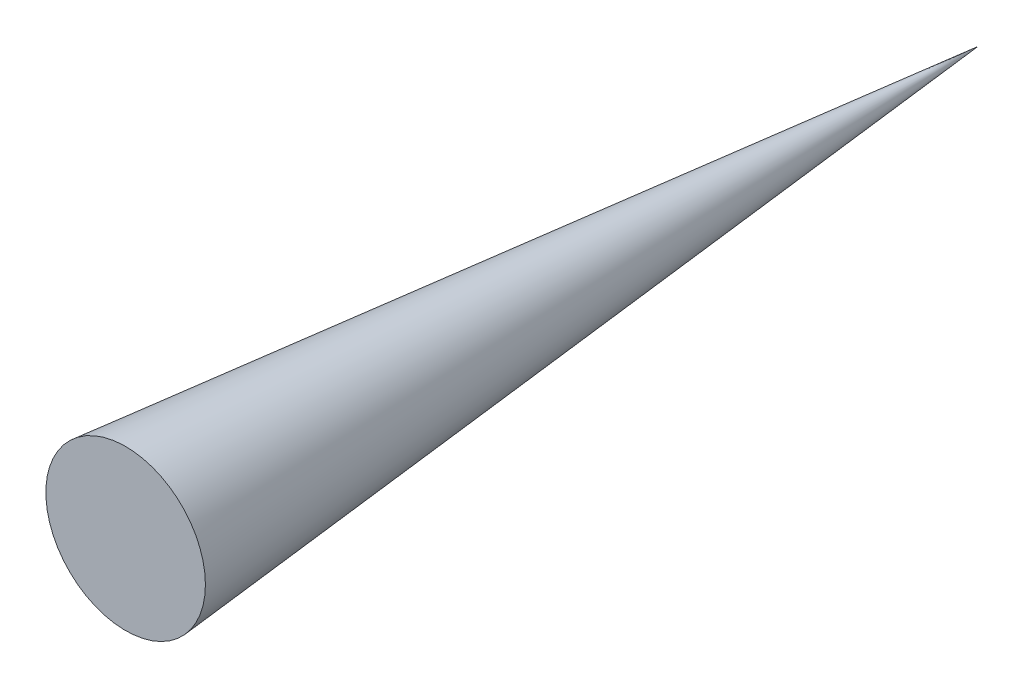
ISO-10303-21;
HEADER;
FILE_DESCRIPTION(('STEP AP214'),'2;1');
FILE_NAME('part.step','',(''),(''),'','','');
FILE_SCHEMA(('AUTOMOTIVE_DESIGN { 1 0 10303 214 1 1 1 1 }'));
ENDSEC;
DATA;
#1=APPLICATION_CONTEXT('core data for automotive mechanical design processes');
#2=APPLICATION_PROTOCOL_DEFINITION('international standard','automotive_design',2000,#1);
#3=PRODUCT_CONTEXT('',#1,'mechanical');
#4=PRODUCT('Part','Part','',(#3));
#5=PRODUCT_RELATED_PRODUCT_CATEGORY('part','',(#4));
#6=PRODUCT_DEFINITION_FORMATION('','',#4);
#7=PRODUCT_DEFINITION_CONTEXT('part definition',#1,'design');
#8=PRODUCT_DEFINITION('design','',#6,#7);
#9=PRODUCT_DEFINITION_SHAPE('','',#8);
#10=(LENGTH_UNIT() NAMED_UNIT(*) SI_UNIT(.MILLI.,.METRE.));
#11=(NAMED_UNIT(*) PLANE_ANGLE_UNIT() SI_UNIT($,.RADIAN.));
#12=(NAMED_UNIT(*) SI_UNIT($,.STERADIAN.) SOLID_ANGLE_UNIT());
#13=UNCERTAINTY_MEASURE_WITH_UNIT(LENGTH_MEASURE(1.E-05),#10,'distance_accuracy_value','');
#14=(GEOMETRIC_REPRESENTATION_CONTEXT(3) GLOBAL_UNCERTAINTY_ASSIGNED_CONTEXT((#13)) GLOBAL_UNIT_ASSIGNED_CONTEXT((#10,
#11,#12)) REPRESENTATION_CONTEXT('',''));
#15=CARTESIAN_POINT('',(0.,0.,0.));
#16=DIRECTION('',(0.,0.,1.));
#17=DIRECTION('',(1.,0.,0.));
#18=AXIS2_PLACEMENT_3D('',#15,#16,#17);
#19=CARTESIAN_POINT('',(0.,0.,-320.5));
#20=DIRECTION('',(0.,0.,1.));
#21=DIRECTION('',(1.,0.,0.));
#22=AXIS2_PLACEMENT_3D('',#19,#20,#21);
#23=CONICAL_SURFACE('',#22,0.,0.0933317975910764);
#24=CARTESIAN_POINT('',(0.,0.,0.));
#25=DIRECTION('',(0.,0.,1.));
#26=DIRECTION('',(1.,0.,0.));
#27=AXIS2_PLACEMENT_3D('',#24,#25,#26);
#28=CIRCLE('',#27,30.);
#29=CARTESIAN_POINT('',(30.,0.,0.));
#30=VERTEX_POINT('',#29);
#31=EDGE_CURVE('E11',#30,#30,#28,.T.);
#32=ORIENTED_EDGE('',*,*,#31,.F.);
#33=EDGE_LOOP('',(#32));
#34=FACE_BOUND('',#33,.T.);
#35=CARTESIAN_POINT('',(0.,0.,-320.5));
#36=VERTEX_POINT('',#35);
#37=VERTEX_LOOP('',#36);
#38=FACE_BOUND('',#37,.T.);
#39=ADVANCED_FACE('F39',(#34,#38),#23,.T.);
#40=CARTESIAN_POINT('',(0.,0.,0.));
#41=DIRECTION('',(0.,0.,-1.));
#42=DIRECTION('',(-1.,0.,0.));
#43=AXIS2_PLACEMENT_3D('',#40,#41,#42);
#44=PLANE('',#43);
#45=ORIENTED_EDGE('',*,*,#31,.T.);
#46=EDGE_LOOP('',(#45));
#47=FACE_BOUND('',#46,.T.);
#48=ADVANCED_FACE('F47',(#47),#44,.F.);
#49=CLOSED_SHELL('',(#39,#48));
#50=MANIFOLD_SOLID_BREP('B2',#49);
#51=ADVANCED_BREP_SHAPE_REPRESENTATION('',(#18,#50),#14);
#52=SHAPE_DEFINITION_REPRESENTATION(#9,#51);
ENDSEC;
END-ISO-10303-21;
